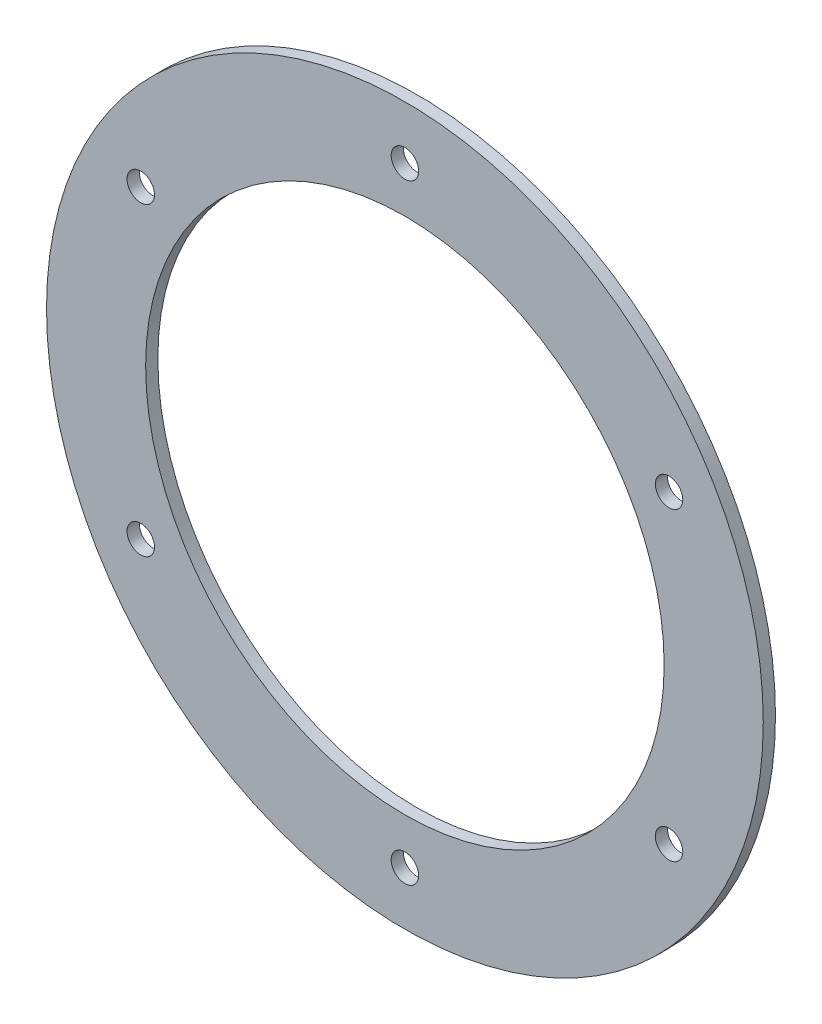
ISO-10303-21;
HEADER;
FILE_DESCRIPTION(('STEP AP214'),'2;1');
FILE_NAME('part.step','',(''),(''),'','','');
FILE_SCHEMA(('AUTOMOTIVE_DESIGN { 1 0 10303 214 1 1 1 1 }'));
ENDSEC;
DATA;
#1=APPLICATION_CONTEXT('core data for automotive mechanical design processes');
#2=APPLICATION_PROTOCOL_DEFINITION('international standard','automotive_design',2000,#1);
#3=PRODUCT_CONTEXT('',#1,'mechanical');
#4=PRODUCT('Part','Part','',(#3));
#5=PRODUCT_RELATED_PRODUCT_CATEGORY('part','',(#4));
#6=PRODUCT_DEFINITION_FORMATION('','',#4);
#7=PRODUCT_DEFINITION_CONTEXT('part definition',#1,'design');
#8=PRODUCT_DEFINITION('design','',#6,#7);
#9=PRODUCT_DEFINITION_SHAPE('','',#8);
#10=(LENGTH_UNIT() NAMED_UNIT(*) SI_UNIT(.MILLI.,.METRE.));
#11=(NAMED_UNIT(*) PLANE_ANGLE_UNIT() SI_UNIT($,.RADIAN.));
#12=(NAMED_UNIT(*) SI_UNIT($,.STERADIAN.) SOLID_ANGLE_UNIT());
#13=UNCERTAINTY_MEASURE_WITH_UNIT(LENGTH_MEASURE(1.E-05),#10,'distance_accuracy_value','');
#14=(GEOMETRIC_REPRESENTATION_CONTEXT(3) GLOBAL_UNCERTAINTY_ASSIGNED_CONTEXT((#13)) GLOBAL_UNIT_ASSIGNED_CONTEXT((#10,
#11,#12)) REPRESENTATION_CONTEXT('',''));
#15=CARTESIAN_POINT('',(0.,0.,0.));
#16=DIRECTION('',(0.,0.,1.));
#17=DIRECTION('',(1.,0.,0.));
#18=AXIS2_PLACEMENT_3D('',#15,#16,#17);
#19=CARTESIAN_POINT('',(0.,0.,2.4));
#20=DIRECTION('',(0.,0.,1.));
#21=DIRECTION('',(1.,0.,0.));
#22=AXIS2_PLACEMENT_3D('',#19,#20,#21);
#23=PLANE('',#22);
#24=CARTESIAN_POINT('',(-17.3205080756888,-10.,2.4));
#25=DIRECTION('',(0.,0.,1.));
#26=DIRECTION('',(1.,0.,0.));
#27=AXIS2_PLACEMENT_3D('',#24,#25,#26);
#28=CIRCLE('',#27,0.899999999999998);
#29=CARTESIAN_POINT('',(-16.4205080756888,-10.,2.4));
#30=VERTEX_POINT('',#29);
#31=EDGE_CURVE('E84',#30,#30,#28,.T.);
#32=ORIENTED_EDGE('',*,*,#31,.F.);
#33=EDGE_LOOP('',(#32));
#34=FACE_BOUND('',#33,.T.);
#35=CARTESIAN_POINT('',(17.3205080756888,-9.99999999999999,2.4));
#36=DIRECTION('',(0.,0.,1.));
#37=DIRECTION('',(1.,0.,0.));
#38=AXIS2_PLACEMENT_3D('',#35,#36,#37);
#39=CIRCLE('',#38,0.899999999999998);
#40=CARTESIAN_POINT('',(18.2205080756888,-9.99999999999999,2.4));
#41=VERTEX_POINT('',#40);
#42=EDGE_CURVE('E72',#41,#41,#39,.T.);
#43=ORIENTED_EDGE('',*,*,#42,.F.);
#44=EDGE_LOOP('',(#43));
#45=FACE_BOUND('',#44,.T.);
#46=CARTESIAN_POINT('',(0.,20.,2.4));
#47=DIRECTION('',(0.,0.,1.));
#48=DIRECTION('',(1.,0.,0.));
#49=AXIS2_PLACEMENT_3D('',#46,#47,#48);
#50=CIRCLE('',#49,0.9);
#51=CARTESIAN_POINT('',(0.900000000000002,20.,2.4));
#52=VERTEX_POINT('',#51);
#53=EDGE_CURVE('E60',#52,#52,#50,.T.);
#54=ORIENTED_EDGE('',*,*,#53,.F.);
#55=EDGE_LOOP('',(#54));
#56=FACE_BOUND('',#55,.T.);
#57=CARTESIAN_POINT('',(0.,0.,2.4));
#58=DIRECTION('',(0.,0.,1.));
#59=DIRECTION('',(1.,0.,0.));
#60=AXIS2_PLACEMENT_3D('',#57,#58,#59);
#61=CIRCLE('',#60,23.5);
#62=CARTESIAN_POINT('',(23.5,0.,2.4));
#63=VERTEX_POINT('',#62);
#64=EDGE_CURVE('E11',#63,#63,#61,.T.);
#65=ORIENTED_EDGE('',*,*,#64,.T.);
#66=EDGE_LOOP('',(#65));
#67=FACE_BOUND('',#66,.T.);
#68=CARTESIAN_POINT('',(0.,0.,2.4));
#69=DIRECTION('',(0.,0.,1.));
#70=DIRECTION('',(1.,0.,0.));
#71=AXIS2_PLACEMENT_3D('',#68,#69,#70);
#72=CIRCLE('',#71,17.);
#73=CARTESIAN_POINT('',(17.,0.,2.4));
#74=VERTEX_POINT('',#73);
#75=EDGE_CURVE('E55',#74,#74,#72,.T.);
#76=ORIENTED_EDGE('',*,*,#75,.F.);
#77=EDGE_LOOP('',(#76));
#78=FACE_BOUND('',#77,.T.);
#79=CARTESIAN_POINT('',(17.3205080756888,10.,2.4));
#80=DIRECTION('',(0.,0.,1.));
#81=DIRECTION('',(1.,0.,0.));
#82=AXIS2_PLACEMENT_3D('',#79,#80,#81);
#83=CIRCLE('',#82,0.899999999999998);
#84=CARTESIAN_POINT('',(18.2205080756888,10.,2.4));
#85=VERTEX_POINT('',#84);
#86=EDGE_CURVE('E66',#85,#85,#83,.T.);
#87=ORIENTED_EDGE('',*,*,#86,.F.);
#88=EDGE_LOOP('',(#87));
#89=FACE_BOUND('',#88,.T.);
#90=CARTESIAN_POINT('',(0.,-20.,2.4));
#91=DIRECTION('',(0.,0.,1.));
#92=DIRECTION('',(1.,0.,0.));
#93=AXIS2_PLACEMENT_3D('',#90,#91,#92);
#94=CIRCLE('',#93,0.9);
#95=CARTESIAN_POINT('',(0.900000000000008,-20.,2.4));
#96=VERTEX_POINT('',#95);
#97=EDGE_CURVE('E78',#96,#96,#94,.T.);
#98=ORIENTED_EDGE('',*,*,#97,.F.);
#99=EDGE_LOOP('',(#98));
#100=FACE_BOUND('',#99,.T.);
#101=CARTESIAN_POINT('',(-17.3205080756888,10.,2.4));
#102=DIRECTION('',(0.,0.,1.));
#103=DIRECTION('',(1.,0.,0.));
#104=AXIS2_PLACEMENT_3D('',#101,#102,#103);
#105=CIRCLE('',#104,0.899999999999998);
#106=CARTESIAN_POINT('',(-16.4205080756888,10.,2.4));
#107=VERTEX_POINT('',#106);
#108=EDGE_CURVE('E90',#107,#107,#105,.T.);
#109=ORIENTED_EDGE('',*,*,#108,.F.);
#110=EDGE_LOOP('',(#109));
#111=FACE_BOUND('',#110,.T.);
#112=ADVANCED_FACE('F44',(#34,#45,#56,#67,#78,#89,#100,#111),#23,.T.);
#113=CARTESIAN_POINT('',(0.,0.,1.6));
#114=DIRECTION('',(0.,0.,1.));
#115=DIRECTION('',(1.,0.,0.));
#116=AXIS2_PLACEMENT_3D('',#113,#114,#115);
#117=PLANE('',#116);
#118=CARTESIAN_POINT('',(0.,0.,1.6));
#119=DIRECTION('',(0.,0.,1.));
#120=DIRECTION('',(1.,0.,0.));
#121=AXIS2_PLACEMENT_3D('',#118,#119,#120);
#122=CIRCLE('',#121,23.5);
#123=CARTESIAN_POINT('',(23.5,0.,1.6));
#124=VERTEX_POINT('',#123);
#125=EDGE_CURVE('E48',#124,#124,#122,.T.);
#126=ORIENTED_EDGE('',*,*,#125,.F.);
#127=EDGE_LOOP('',(#126));
#128=FACE_BOUND('',#127,.T.);
#129=CARTESIAN_POINT('',(0.,0.,1.6));
#130=DIRECTION('',(0.,0.,1.));
#131=DIRECTION('',(1.,0.,0.));
#132=AXIS2_PLACEMENT_3D('',#129,#130,#131);
#133=CIRCLE('',#132,17.);
#134=CARTESIAN_POINT('',(17.,0.,1.6));
#135=VERTEX_POINT('',#134);
#136=EDGE_CURVE('E57',#135,#135,#133,.T.);
#137=ORIENTED_EDGE('',*,*,#136,.T.);
#138=EDGE_LOOP('',(#137));
#139=FACE_BOUND('',#138,.T.);
#140=CARTESIAN_POINT('',(0.,20.,1.6));
#141=DIRECTION('',(0.,0.,1.));
#142=DIRECTION('',(1.,0.,0.));
#143=AXIS2_PLACEMENT_3D('',#140,#141,#142);
#144=CIRCLE('',#143,0.9);
#145=CARTESIAN_POINT('',(0.900000000000002,20.,1.6));
#146=VERTEX_POINT('',#145);
#147=EDGE_CURVE('E63',#146,#146,#144,.T.);
#148=ORIENTED_EDGE('',*,*,#147,.T.);
#149=EDGE_LOOP('',(#148));
#150=FACE_BOUND('',#149,.T.);
#151=CARTESIAN_POINT('',(17.3205080756888,10.,1.6));
#152=DIRECTION('',(0.,0.,1.));
#153=DIRECTION('',(1.,0.,0.));
#154=AXIS2_PLACEMENT_3D('',#151,#152,#153);
#155=CIRCLE('',#154,0.899999999999998);
#156=CARTESIAN_POINT('',(18.2205080756888,10.,1.6));
#157=VERTEX_POINT('',#156);
#158=EDGE_CURVE('E69',#157,#157,#155,.T.);
#159=ORIENTED_EDGE('',*,*,#158,.T.);
#160=EDGE_LOOP('',(#159));
#161=FACE_BOUND('',#160,.T.);
#162=CARTESIAN_POINT('',(17.3205080756888,-9.99999999999999,1.6));
#163=DIRECTION('',(0.,0.,1.));
#164=DIRECTION('',(1.,0.,0.));
#165=AXIS2_PLACEMENT_3D('',#162,#163,#164);
#166=CIRCLE('',#165,0.899999999999998);
#167=CARTESIAN_POINT('',(18.2205080756888,-9.99999999999999,1.6));
#168=VERTEX_POINT('',#167);
#169=EDGE_CURVE('E75',#168,#168,#166,.T.);
#170=ORIENTED_EDGE('',*,*,#169,.T.);
#171=EDGE_LOOP('',(#170));
#172=FACE_BOUND('',#171,.T.);
#173=CARTESIAN_POINT('',(0.,-20.,1.6));
#174=DIRECTION('',(0.,0.,1.));
#175=DIRECTION('',(1.,0.,0.));
#176=AXIS2_PLACEMENT_3D('',#173,#174,#175);
#177=CIRCLE('',#176,0.9);
#178=CARTESIAN_POINT('',(0.900000000000008,-20.,1.6));
#179=VERTEX_POINT('',#178);
#180=EDGE_CURVE('E81',#179,#179,#177,.T.);
#181=ORIENTED_EDGE('',*,*,#180,.T.);
#182=EDGE_LOOP('',(#181));
#183=FACE_BOUND('',#182,.T.);
#184=CARTESIAN_POINT('',(-17.3205080756888,-10.,1.6));
#185=DIRECTION('',(0.,0.,1.));
#186=DIRECTION('',(1.,0.,0.));
#187=AXIS2_PLACEMENT_3D('',#184,#185,#186);
#188=CIRCLE('',#187,0.899999999999998);
#189=CARTESIAN_POINT('',(-16.4205080756888,-10.,1.6));
#190=VERTEX_POINT('',#189);
#191=EDGE_CURVE('E87',#190,#190,#188,.T.);
#192=ORIENTED_EDGE('',*,*,#191,.T.);
#193=EDGE_LOOP('',(#192));
#194=FACE_BOUND('',#193,.T.);
#195=CARTESIAN_POINT('',(-17.3205080756888,10.,1.6));
#196=DIRECTION('',(0.,0.,1.));
#197=DIRECTION('',(1.,0.,0.));
#198=AXIS2_PLACEMENT_3D('',#195,#196,#197);
#199=CIRCLE('',#198,0.899999999999998);
#200=CARTESIAN_POINT('',(-16.4205080756888,10.,1.6));
#201=VERTEX_POINT('',#200);
#202=EDGE_CURVE('E93',#201,#201,#199,.T.);
#203=ORIENTED_EDGE('',*,*,#202,.T.);
#204=EDGE_LOOP('',(#203));
#205=FACE_BOUND('',#204,.T.);
#206=ADVANCED_FACE('F103',(#128,#139,#150,#161,#172,#183,#194,#205),#117,.F.);
#207=CARTESIAN_POINT('',(0.,0.,2.4));
#208=DIRECTION('',(0.,0.,-1.));
#209=DIRECTION('',(-1.,0.,0.));
#210=AXIS2_PLACEMENT_3D('',#207,#208,#209);
#211=CYLINDRICAL_SURFACE('',#210,23.5);
#212=ORIENTED_EDGE('',*,*,#64,.F.);
#213=EDGE_LOOP('',(#212));
#214=FACE_BOUND('',#213,.T.);
#215=ORIENTED_EDGE('',*,*,#125,.T.);
#216=EDGE_LOOP('',(#215));
#217=FACE_BOUND('',#216,.T.);
#218=ADVANCED_FACE('F46',(#214,#217),#211,.T.);
#219=CARTESIAN_POINT('',(0.,0.,2.4));
#220=DIRECTION('',(0.,0.,-1.));
#221=DIRECTION('',(-1.,0.,0.));
#222=AXIS2_PLACEMENT_3D('',#219,#220,#221);
#223=CYLINDRICAL_SURFACE('',#222,17.);
#224=ORIENTED_EDGE('',*,*,#75,.T.);
#225=EDGE_LOOP('',(#224));
#226=FACE_BOUND('',#225,.T.);
#227=ORIENTED_EDGE('',*,*,#136,.F.);
#228=EDGE_LOOP('',(#227));
#229=FACE_BOUND('',#228,.T.);
#230=ADVANCED_FACE('F113',(#226,#229),#223,.F.);
#231=CARTESIAN_POINT('',(0.,20.,2.4));
#232=DIRECTION('',(0.,0.,-1.));
#233=DIRECTION('',(-1.,0.,0.));
#234=AXIS2_PLACEMENT_3D('',#231,#232,#233);
#235=CYLINDRICAL_SURFACE('',#234,0.9);
#236=ORIENTED_EDGE('',*,*,#53,.T.);
#237=EDGE_LOOP('',(#236));
#238=FACE_BOUND('',#237,.T.);
#239=ORIENTED_EDGE('',*,*,#147,.F.);
#240=EDGE_LOOP('',(#239));
#241=FACE_BOUND('',#240,.T.);
#242=ADVANCED_FACE('F116',(#238,#241),#235,.F.);
#243=CARTESIAN_POINT('',(17.3205080756888,10.,2.4));
#244=DIRECTION('',(0.,0.,-1.));
#245=DIRECTION('',(-1.,0.,0.));
#246=AXIS2_PLACEMENT_3D('',#243,#244,#245);
#247=CYLINDRICAL_SURFACE('',#246,0.899999999999998);
#248=ORIENTED_EDGE('',*,*,#86,.T.);
#249=EDGE_LOOP('',(#248));
#250=FACE_BOUND('',#249,.T.);
#251=ORIENTED_EDGE('',*,*,#158,.F.);
#252=EDGE_LOOP('',(#251));
#253=FACE_BOUND('',#252,.T.);
#254=ADVANCED_FACE('F120',(#250,#253),#247,.F.);
#255=CARTESIAN_POINT('',(17.3205080756888,-9.99999999999999,2.4));
#256=DIRECTION('',(0.,0.,-1.));
#257=DIRECTION('',(-1.,0.,0.));
#258=AXIS2_PLACEMENT_3D('',#255,#256,#257);
#259=CYLINDRICAL_SURFACE('',#258,0.899999999999998);
#260=ORIENTED_EDGE('',*,*,#42,.T.);
#261=EDGE_LOOP('',(#260));
#262=FACE_BOUND('',#261,.T.);
#263=ORIENTED_EDGE('',*,*,#169,.F.);
#264=EDGE_LOOP('',(#263));
#265=FACE_BOUND('',#264,.T.);
#266=ADVANCED_FACE('F124',(#262,#265),#259,.F.);
#267=CARTESIAN_POINT('',(0.,-20.,2.4));
#268=DIRECTION('',(0.,0.,-1.));
#269=DIRECTION('',(-1.,0.,0.));
#270=AXIS2_PLACEMENT_3D('',#267,#268,#269);
#271=CYLINDRICAL_SURFACE('',#270,0.9);
#272=ORIENTED_EDGE('',*,*,#97,.T.);
#273=EDGE_LOOP('',(#272));
#274=FACE_BOUND('',#273,.T.);
#275=ORIENTED_EDGE('',*,*,#180,.F.);
#276=EDGE_LOOP('',(#275));
#277=FACE_BOUND('',#276,.T.);
#278=ADVANCED_FACE('F128',(#274,#277),#271,.F.);
#279=CARTESIAN_POINT('',(-17.3205080756888,-10.,2.4));
#280=DIRECTION('',(0.,0.,-1.));
#281=DIRECTION('',(-1.,0.,0.));
#282=AXIS2_PLACEMENT_3D('',#279,#280,#281);
#283=CYLINDRICAL_SURFACE('',#282,0.899999999999998);
#284=ORIENTED_EDGE('',*,*,#31,.T.);
#285=EDGE_LOOP('',(#284));
#286=FACE_BOUND('',#285,.T.);
#287=ORIENTED_EDGE('',*,*,#191,.F.);
#288=EDGE_LOOP('',(#287));
#289=FACE_BOUND('',#288,.T.);
#290=ADVANCED_FACE('F132',(#286,#289),#283,.F.);
#291=CARTESIAN_POINT('',(-17.3205080756888,10.,2.4));
#292=DIRECTION('',(0.,0.,-1.));
#293=DIRECTION('',(-1.,0.,0.));
#294=AXIS2_PLACEMENT_3D('',#291,#292,#293);
#295=CYLINDRICAL_SURFACE('',#294,0.899999999999998);
#296=ORIENTED_EDGE('',*,*,#108,.T.);
#297=EDGE_LOOP('',(#296));
#298=FACE_BOUND('',#297,.T.);
#299=ORIENTED_EDGE('',*,*,#202,.F.);
#300=EDGE_LOOP('',(#299));
#301=FACE_BOUND('',#300,.T.);
#302=ADVANCED_FACE('F99',(#298,#301),#295,.F.);
#303=CLOSED_SHELL('',(#112,#206,#218,#230,#242,#254,#266,#278,#290,#302));
#304=MANIFOLD_SOLID_BREP('B2',#303);
#305=ADVANCED_BREP_SHAPE_REPRESENTATION('',(#18,#304),#14);
#306=SHAPE_DEFINITION_REPRESENTATION(#9,#305);
ENDSEC;
END-ISO-10303-21;
